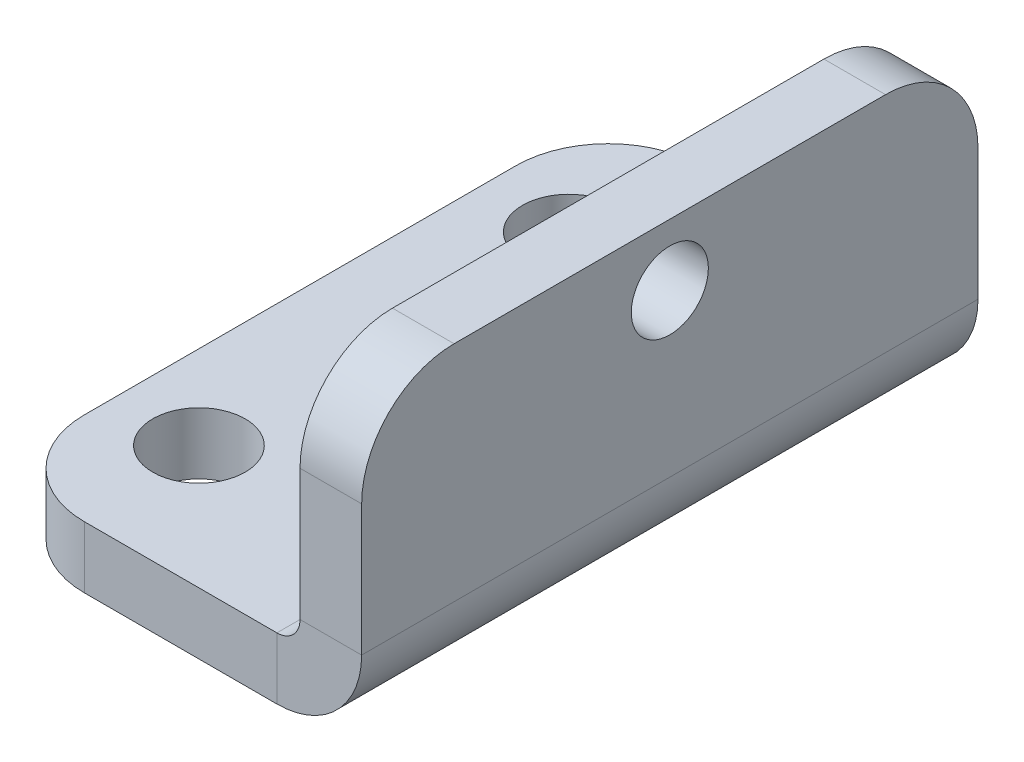
ISO-10303-21;
HEADER;
FILE_DESCRIPTION(('STEP AP214'),'2;1');
FILE_NAME('part.step','',(''),(''),'','','');
FILE_SCHEMA(('AUTOMOTIVE_DESIGN { 1 0 10303 214 1 1 1 1 }'));
ENDSEC;
DATA;
#1=APPLICATION_CONTEXT('core data for automotive mechanical design processes');
#2=APPLICATION_PROTOCOL_DEFINITION('international standard','automotive_design',2000,#1);
#3=PRODUCT_CONTEXT('',#1,'mechanical');
#4=PRODUCT('Part','Part','',(#3));
#5=PRODUCT_RELATED_PRODUCT_CATEGORY('part','',(#4));
#6=PRODUCT_DEFINITION_FORMATION('','',#4);
#7=PRODUCT_DEFINITION_CONTEXT('part definition',#1,'design');
#8=PRODUCT_DEFINITION('design','',#6,#7);
#9=PRODUCT_DEFINITION_SHAPE('','',#8);
#10=(LENGTH_UNIT() NAMED_UNIT(*) SI_UNIT(.MILLI.,.METRE.));
#11=(NAMED_UNIT(*) PLANE_ANGLE_UNIT() SI_UNIT($,.RADIAN.));
#12=(NAMED_UNIT(*) SI_UNIT($,.STERADIAN.) SOLID_ANGLE_UNIT());
#13=UNCERTAINTY_MEASURE_WITH_UNIT(LENGTH_MEASURE(1.E-05),#10,'distance_accuracy_value','');
#14=(GEOMETRIC_REPRESENTATION_CONTEXT(3) GLOBAL_UNCERTAINTY_ASSIGNED_CONTEXT((#13)) GLOBAL_UNIT_ASSIGNED_CONTEXT((#10,
#11,#12)) REPRESENTATION_CONTEXT('',''));
#15=CARTESIAN_POINT('',(0.,0.,0.));
#16=DIRECTION('',(0.,0.,1.));
#17=DIRECTION('',(1.,0.,0.));
#18=AXIS2_PLACEMENT_3D('',#15,#16,#17);
#19=CARTESIAN_POINT('',(3.,2.,7.));
#20=DIRECTION('',(0.,1.,0.));
#21=DIRECTION('',(0.,0.,1.));
#22=AXIS2_PLACEMENT_3D('',#19,#20,#21);
#23=PLANE('',#22);
#24=CARTESIAN_POINT('',(2.72,2.,-6.));
#25=DIRECTION('',(0.,1.,0.));
#26=DIRECTION('',(0.,0.,1.));
#27=AXIS2_PLACEMENT_3D('',#24,#25,#26);
#28=CIRCLE('',#27,1.5);
#29=CARTESIAN_POINT('',(2.72,2.,-4.5));
#30=VERTEX_POINT('',#29);
#31=EDGE_CURVE('E227',#30,#30,#28,.T.);
#32=ORIENTED_EDGE('',*,*,#31,.F.);
#33=EDGE_LOOP('',(#32));
#34=FACE_BOUND('',#33,.T.);
#35=CARTESIAN_POINT('',(2.72,2.,6.));
#36=DIRECTION('',(0.,1.,0.));
#37=DIRECTION('',(0.,0.,1.));
#38=AXIS2_PLACEMENT_3D('',#35,#36,#37);
#39=CIRCLE('',#38,1.5);
#40=CARTESIAN_POINT('',(2.72,2.,7.5));
#41=VERTEX_POINT('',#40);
#42=EDGE_CURVE('E221',#41,#41,#39,.T.);
#43=ORIENTED_EDGE('',*,*,#42,.F.);
#44=EDGE_LOOP('',(#43));
#45=FACE_BOUND('',#44,.T.);
#46=DIRECTION('',(1.,0.,0.));
#47=VECTOR('',#46,1.);
#48=CARTESIAN_POINT('',(3.,2.,10.));
#49=LINE('',#48,#47);
#50=CARTESIAN_POINT('',(3.,2.,10.));
#51=VERTEX_POINT('',#50);
#52=CARTESIAN_POINT('',(9.25,2.,10.));
#53=VERTEX_POINT('',#52);
#54=EDGE_CURVE('E242',#51,#53,#49,.T.);
#55=ORIENTED_EDGE('',*,*,#54,.T.);
#56=DIRECTION('',(0.,0.,-1.));
#57=VECTOR('',#56,1.);
#58=CARTESIAN_POINT('',(9.25,2.,-10.));
#59=LINE('',#58,#57);
#60=CARTESIAN_POINT('',(9.25,2.,-10.));
#61=VERTEX_POINT('',#60);
#62=EDGE_CURVE('E211',#61,#53,#59,.F.);
#63=ORIENTED_EDGE('',*,*,#62,.F.);
#64=DIRECTION('',(-1.,0.,0.));
#65=VECTOR('',#64,1.);
#66=CARTESIAN_POINT('',(3.,2.,-10.));
#67=LINE('',#66,#65);
#68=CARTESIAN_POINT('',(3.,2.,-10.));
#69=VERTEX_POINT('',#68);
#70=EDGE_CURVE('E233',#61,#69,#67,.T.);
#71=ORIENTED_EDGE('',*,*,#70,.T.);
#72=CARTESIAN_POINT('',(3.,2.,-7.));
#73=DIRECTION('',(0.,1.,0.));
#74=DIRECTION('',(0.,0.,-1.));
#75=AXIS2_PLACEMENT_3D('',#72,#73,#74);
#76=CIRCLE('',#75,3.);
#77=CARTESIAN_POINT('',(0.,2.,-7.));
#78=VERTEX_POINT('',#77);
#79=EDGE_CURVE('E235',#69,#78,#76,.T.);
#80=ORIENTED_EDGE('',*,*,#79,.T.);
#81=DIRECTION('',(0.,0.,1.));
#82=VECTOR('',#81,1.);
#83=CARTESIAN_POINT('',(0.,2.,-7.));
#84=LINE('',#83,#82);
#85=CARTESIAN_POINT('',(0.,2.,7.));
#86=VERTEX_POINT('',#85);
#87=EDGE_CURVE('E238',#78,#86,#84,.T.);
#88=ORIENTED_EDGE('',*,*,#87,.T.);
#89=CARTESIAN_POINT('',(3.,2.,7.));
#90=DIRECTION('',(0.,1.,0.));
#91=DIRECTION('',(0.,0.,1.));
#92=AXIS2_PLACEMENT_3D('',#89,#90,#91);
#93=CIRCLE('',#92,3.);
#94=EDGE_CURVE('E240',#86,#51,#93,.T.);
#95=ORIENTED_EDGE('',*,*,#94,.T.);
#96=EDGE_LOOP('',(#55,#63,#71,#80,#88,#95));
#97=FACE_BOUND('',#96,.T.);
#98=ADVANCED_FACE('F67',(#34,#45,#97),#23,.T.);
#99=CARTESIAN_POINT('',(3.,0.,7.));
#100=DIRECTION('',(0.,1.,0.));
#101=DIRECTION('',(0.,0.,1.));
#102=AXIS2_PLACEMENT_3D('',#99,#100,#101);
#103=PLANE('',#102);
#104=CARTESIAN_POINT('',(2.72,0.,6.));
#105=DIRECTION('',(0.,1.,0.));
#106=DIRECTION('',(0.,0.,1.));
#107=AXIS2_PLACEMENT_3D('',#104,#105,#106);
#108=CIRCLE('',#107,1.5);
#109=CARTESIAN_POINT('',(2.72,0.,7.5));
#110=VERTEX_POINT('',#109);
#111=EDGE_CURVE('E218',#110,#110,#108,.T.);
#112=ORIENTED_EDGE('',*,*,#111,.T.);
#113=EDGE_LOOP('',(#112));
#114=FACE_BOUND('',#113,.T.);
#115=CARTESIAN_POINT('',(2.72,0.,-6.));
#116=DIRECTION('',(0.,1.,0.));
#117=DIRECTION('',(0.,0.,1.));
#118=AXIS2_PLACEMENT_3D('',#115,#116,#117);
#119=CIRCLE('',#118,1.5);
#120=CARTESIAN_POINT('',(2.72,0.,-4.5));
#121=VERTEX_POINT('',#120);
#122=EDGE_CURVE('E224',#121,#121,#119,.T.);
#123=ORIENTED_EDGE('',*,*,#122,.T.);
#124=EDGE_LOOP('',(#123));
#125=FACE_BOUND('',#124,.T.);
#126=DIRECTION('',(0.,0.,-1.));
#127=VECTOR('',#126,1.);
#128=CARTESIAN_POINT('',(9.25,0.,-10.));
#129=LINE('',#128,#127);
#130=CARTESIAN_POINT('',(9.25,0.,-10.));
#131=VERTEX_POINT('',#130);
#132=CARTESIAN_POINT('',(9.25,0.,10.));
#133=VERTEX_POINT('',#132);
#134=EDGE_CURVE('E167',#131,#133,#129,.F.);
#135=ORIENTED_EDGE('',*,*,#134,.T.);
#136=DIRECTION('',(1.,0.,0.));
#137=VECTOR('',#136,1.);
#138=CARTESIAN_POINT('',(3.,0.,10.));
#139=LINE('',#138,#137);
#140=CARTESIAN_POINT('',(3.,0.,10.));
#141=VERTEX_POINT('',#140);
#142=EDGE_CURVE('E236',#141,#133,#139,.T.);
#143=ORIENTED_EDGE('',*,*,#142,.F.);
#144=CARTESIAN_POINT('',(3.,0.,7.));
#145=DIRECTION('',(0.,1.,0.));
#146=DIRECTION('',(0.,0.,1.));
#147=AXIS2_PLACEMENT_3D('',#144,#145,#146);
#148=CIRCLE('',#147,3.);
#149=CARTESIAN_POINT('',(0.,0.,7.));
#150=VERTEX_POINT('',#149);
#151=EDGE_CURVE('E251',#150,#141,#148,.T.);
#152=ORIENTED_EDGE('',*,*,#151,.F.);
#153=DIRECTION('',(0.,0.,1.));
#154=VECTOR('',#153,1.);
#155=CARTESIAN_POINT('',(0.,0.,-7.));
#156=LINE('',#155,#154);
#157=CARTESIAN_POINT('',(0.,0.,-7.));
#158=VERTEX_POINT('',#157);
#159=EDGE_CURVE('E249',#158,#150,#156,.T.);
#160=ORIENTED_EDGE('',*,*,#159,.F.);
#161=CARTESIAN_POINT('',(3.,0.,-7.));
#162=DIRECTION('',(0.,1.,0.));
#163=DIRECTION('',(0.,0.,-1.));
#164=AXIS2_PLACEMENT_3D('',#161,#162,#163);
#165=CIRCLE('',#164,3.);
#166=CARTESIAN_POINT('',(3.,0.,-10.));
#167=VERTEX_POINT('',#166);
#168=EDGE_CURVE('E247',#167,#158,#165,.T.);
#169=ORIENTED_EDGE('',*,*,#168,.F.);
#170=DIRECTION('',(-1.,0.,0.));
#171=VECTOR('',#170,1.);
#172=CARTESIAN_POINT('',(3.,0.,-10.));
#173=LINE('',#172,#171);
#174=EDGE_CURVE('E230',#131,#167,#173,.T.);
#175=ORIENTED_EDGE('',*,*,#174,.F.);
#176=EDGE_LOOP('',(#135,#143,#152,#160,#169,#175));
#177=FACE_BOUND('',#176,.T.);
#178=ADVANCED_FACE('F311',(#114,#125,#177),#103,.F.);
#179=CARTESIAN_POINT('',(3.,2.,-10.));
#180=DIRECTION('',(0.,0.,1.));
#181=DIRECTION('',(1.,0.,0.));
#182=AXIS2_PLACEMENT_3D('',#179,#180,#181);
#183=PLANE('',#182);
#184=DIRECTION('',(0.,-1.,0.));
#185=VECTOR('',#184,1.);
#186=CARTESIAN_POINT('',(9.25,2.,-10.));
#187=LINE('',#186,#185);
#188=EDGE_CURVE('E207',#61,#131,#187,.T.);
#189=ORIENTED_EDGE('',*,*,#188,.T.);
#190=ORIENTED_EDGE('',*,*,#174,.T.);
#191=DIRECTION('',(0.,-1.,0.));
#192=VECTOR('',#191,1.);
#193=CARTESIAN_POINT('',(3.,2.,-10.));
#194=LINE('',#193,#192);
#195=EDGE_CURVE('E262',#69,#167,#194,.T.);
#196=ORIENTED_EDGE('',*,*,#195,.F.);
#197=ORIENTED_EDGE('',*,*,#70,.F.);
#198=EDGE_LOOP('',(#189,#190,#196,#197));
#199=FACE_BOUND('',#198,.T.);
#200=ADVANCED_FACE('F316',(#199),#183,.F.);
#201=CARTESIAN_POINT('',(3.,2.,10.));
#202=DIRECTION('',(0.,0.,-1.));
#203=DIRECTION('',(-1.,0.,0.));
#204=AXIS2_PLACEMENT_3D('',#201,#202,#203);
#205=PLANE('',#204);
#206=DIRECTION('',(0.,-1.,0.));
#207=VECTOR('',#206,1.);
#208=CARTESIAN_POINT('',(9.25,2.,10.));
#209=LINE('',#208,#207);
#210=EDGE_CURVE('E215',#53,#133,#209,.T.);
#211=ORIENTED_EDGE('',*,*,#210,.F.);
#212=ORIENTED_EDGE('',*,*,#54,.F.);
#213=DIRECTION('',(0.,-1.,0.));
#214=VECTOR('',#213,1.);
#215=CARTESIAN_POINT('',(3.,2.,10.));
#216=LINE('',#215,#214);
#217=EDGE_CURVE('E245',#51,#141,#216,.T.);
#218=ORIENTED_EDGE('',*,*,#217,.T.);
#219=ORIENTED_EDGE('',*,*,#142,.T.);
#220=EDGE_LOOP('',(#211,#212,#218,#219));
#221=FACE_BOUND('',#220,.T.);
#222=ADVANCED_FACE('F299',(#221),#205,.F.);
#223=CARTESIAN_POINT('',(3.,2.,-7.));
#224=DIRECTION('',(0.,-1.,0.));
#225=DIRECTION('',(0.,0.,-1.));
#226=AXIS2_PLACEMENT_3D('',#223,#224,#225);
#227=CYLINDRICAL_SURFACE('',#226,3.);
#228=ORIENTED_EDGE('',*,*,#168,.T.);
#229=DIRECTION('',(0.,-1.,0.));
#230=VECTOR('',#229,1.);
#231=CARTESIAN_POINT('',(0.,2.,-7.));
#232=LINE('',#231,#230);
#233=EDGE_CURVE('E259',#78,#158,#232,.T.);
#234=ORIENTED_EDGE('',*,*,#233,.F.);
#235=ORIENTED_EDGE('',*,*,#79,.F.);
#236=ORIENTED_EDGE('',*,*,#195,.T.);
#237=EDGE_LOOP('',(#228,#234,#235,#236));
#238=FACE_BOUND('',#237,.T.);
#239=ADVANCED_FACE('F320',(#238),#227,.T.);
#240=CARTESIAN_POINT('',(0.,2.,-7.));
#241=DIRECTION('',(1.,0.,0.));
#242=DIRECTION('',(0.,0.,-1.));
#243=AXIS2_PLACEMENT_3D('',#240,#241,#242);
#244=PLANE('',#243);
#245=ORIENTED_EDGE('',*,*,#159,.T.);
#246=DIRECTION('',(0.,-1.,0.));
#247=VECTOR('',#246,1.);
#248=CARTESIAN_POINT('',(0.,2.,7.));
#249=LINE('',#248,#247);
#250=EDGE_CURVE('E256',#86,#150,#249,.T.);
#251=ORIENTED_EDGE('',*,*,#250,.F.);
#252=ORIENTED_EDGE('',*,*,#87,.F.);
#253=ORIENTED_EDGE('',*,*,#233,.T.);
#254=EDGE_LOOP('',(#245,#251,#252,#253));
#255=FACE_BOUND('',#254,.T.);
#256=ADVANCED_FACE('F322',(#255),#244,.F.);
#257=CARTESIAN_POINT('',(3.,2.,7.));
#258=DIRECTION('',(0.,-1.,0.));
#259=DIRECTION('',(0.,0.,-1.));
#260=AXIS2_PLACEMENT_3D('',#257,#258,#259);
#261=CYLINDRICAL_SURFACE('',#260,3.);
#262=ORIENTED_EDGE('',*,*,#151,.T.);
#263=ORIENTED_EDGE('',*,*,#217,.F.);
#264=ORIENTED_EDGE('',*,*,#94,.F.);
#265=ORIENTED_EDGE('',*,*,#250,.T.);
#266=EDGE_LOOP('',(#262,#263,#264,#265));
#267=FACE_BOUND('',#266,.T.);
#268=ADVANCED_FACE('F308',(#267),#261,.T.);
#269=CARTESIAN_POINT('',(2.72,2.,-6.));
#270=DIRECTION('',(0.,-1.,0.));
#271=DIRECTION('',(0.,0.,-1.));
#272=AXIS2_PLACEMENT_3D('',#269,#270,#271);
#273=CYLINDRICAL_SURFACE('',#272,1.5);
#274=ORIENTED_EDGE('',*,*,#31,.T.);
#275=EDGE_LOOP('',(#274));
#276=FACE_BOUND('',#275,.T.);
#277=ORIENTED_EDGE('',*,*,#122,.F.);
#278=EDGE_LOOP('',(#277));
#279=FACE_BOUND('',#278,.T.);
#280=ADVANCED_FACE('F329',(#276,#279),#273,.F.);
#281=CARTESIAN_POINT('',(2.72,2.,6.));
#282=DIRECTION('',(0.,-1.,0.));
#283=DIRECTION('',(0.,0.,-1.));
#284=AXIS2_PLACEMENT_3D('',#281,#282,#283);
#285=CYLINDRICAL_SURFACE('',#284,1.5);
#286=ORIENTED_EDGE('',*,*,#42,.T.);
#287=EDGE_LOOP('',(#286));
#288=FACE_BOUND('',#287,.T.);
#289=ORIENTED_EDGE('',*,*,#111,.F.);
#290=EDGE_LOOP('',(#289));
#291=FACE_BOUND('',#290,.T.);
#292=ADVANCED_FACE('F384',(#288,#291),#285,.F.);
#293=CARTESIAN_POINT('',(9.25,2.75,10.));
#294=DIRECTION('',(0.,0.,1.));
#295=DIRECTION('',(1.,0.,0.));
#296=AXIS2_PLACEMENT_3D('',#293,#294,#295);
#297=PLANE('',#296);
#298=DIRECTION('',(-1.,0.,0.));
#299=VECTOR('',#298,1.);
#300=CARTESIAN_POINT('',(12.,2.74999999999999,10.));
#301=LINE('',#300,#299);
#302=CARTESIAN_POINT('',(10.,2.75,10.));
#303=VERTEX_POINT('',#302);
#304=CARTESIAN_POINT('',(12.,2.74999999999999,10.));
#305=VERTEX_POINT('',#304);
#306=EDGE_CURVE('E201',#303,#305,#301,.F.);
#307=ORIENTED_EDGE('',*,*,#306,.F.);
#308=CARTESIAN_POINT('',(9.25,2.75,10.));
#309=DIRECTION('',(0.,0.,-1.));
#310=DIRECTION('',(-1.,0.,0.));
#311=AXIS2_PLACEMENT_3D('',#308,#309,#310);
#312=CIRCLE('',#311,0.750000000000002);
#313=EDGE_CURVE('E170',#53,#303,#312,.F.);
#314=ORIENTED_EDGE('',*,*,#313,.F.);
#315=ORIENTED_EDGE('',*,*,#210,.T.);
#316=CARTESIAN_POINT('',(9.25,2.75,10.));
#317=DIRECTION('',(0.,0.,-1.));
#318=DIRECTION('',(-1.,0.,0.));
#319=AXIS2_PLACEMENT_3D('',#316,#317,#318);
#320=CIRCLE('',#319,2.75);
#321=EDGE_CURVE('E206',#133,#305,#320,.F.);
#322=ORIENTED_EDGE('',*,*,#321,.T.);
#323=EDGE_LOOP('',(#307,#314,#315,#322));
#324=FACE_BOUND('',#323,.T.);
#325=ADVANCED_FACE('F296',(#324),#297,.T.);
#326=CARTESIAN_POINT('',(9.25,2.75,-10.));
#327=DIRECTION('',(0.,0.,1.));
#328=DIRECTION('',(1.,0.,0.));
#329=AXIS2_PLACEMENT_3D('',#326,#327,#328);
#330=PLANE('',#329);
#331=CARTESIAN_POINT('',(9.25,2.75,-10.));
#332=DIRECTION('',(0.,0.,-1.));
#333=DIRECTION('',(-1.,0.,0.));
#334=AXIS2_PLACEMENT_3D('',#331,#332,#333);
#335=CIRCLE('',#334,0.750000000000002);
#336=CARTESIAN_POINT('',(10.,2.75,-10.));
#337=VERTEX_POINT('',#336);
#338=EDGE_CURVE('E177',#337,#61,#335,.T.);
#339=ORIENTED_EDGE('',*,*,#338,.F.);
#340=DIRECTION('',(-1.,0.,0.));
#341=VECTOR('',#340,1.);
#342=CARTESIAN_POINT('',(10.,2.75,-10.));
#343=LINE('',#342,#341);
#344=CARTESIAN_POINT('',(12.,2.74999999999999,-10.));
#345=VERTEX_POINT('',#344);
#346=EDGE_CURVE('E174',#337,#345,#343,.F.);
#347=ORIENTED_EDGE('',*,*,#346,.T.);
#348=CARTESIAN_POINT('',(9.25,2.75,-10.));
#349=DIRECTION('',(0.,0.,-1.));
#350=DIRECTION('',(-1.,0.,0.));
#351=AXIS2_PLACEMENT_3D('',#348,#349,#350);
#352=CIRCLE('',#351,2.75);
#353=EDGE_CURVE('E159',#345,#131,#352,.T.);
#354=ORIENTED_EDGE('',*,*,#353,.T.);
#355=ORIENTED_EDGE('',*,*,#188,.F.);
#356=EDGE_LOOP('',(#339,#347,#354,#355));
#357=FACE_BOUND('',#356,.T.);
#358=ADVANCED_FACE('F175',(#357),#330,.F.);
#359=CARTESIAN_POINT('',(9.25,2.75,-10.));
#360=DIRECTION('',(0.,0.,-1.));
#361=DIRECTION('',(1.,0.,0.));
#362=AXIS2_PLACEMENT_3D('',#359,#360,#361);
#363=CYLINDRICAL_SURFACE('',#362,2.75);
#364=ORIENTED_EDGE('',*,*,#134,.F.);
#365=ORIENTED_EDGE('',*,*,#353,.F.);
#366=DIRECTION('',(0.,0.,-1.));
#367=VECTOR('',#366,1.);
#368=CARTESIAN_POINT('',(12.,2.74999999999999,10.));
#369=LINE('',#368,#367);
#370=EDGE_CURVE('E164',#345,#305,#369,.F.);
#371=ORIENTED_EDGE('',*,*,#370,.T.);
#372=ORIENTED_EDGE('',*,*,#321,.F.);
#373=EDGE_LOOP('',(#364,#365,#371,#372));
#374=FACE_BOUND('',#373,.T.);
#375=ADVANCED_FACE('F161',(#374),#363,.T.);
#376=CARTESIAN_POINT('',(9.25,2.75,-10.));
#377=DIRECTION('',(0.,0.,-1.));
#378=DIRECTION('',(1.,0.,0.));
#379=AXIS2_PLACEMENT_3D('',#376,#377,#378);
#380=CYLINDRICAL_SURFACE('',#379,0.750000000000002);
#381=ORIENTED_EDGE('',*,*,#62,.T.);
#382=ORIENTED_EDGE('',*,*,#313,.T.);
#383=DIRECTION('',(0.,0.,-1.));
#384=VECTOR('',#383,1.);
#385=CARTESIAN_POINT('',(10.,2.75,10.));
#386=LINE('',#385,#384);
#387=EDGE_CURVE('E179',#303,#337,#386,.T.);
#388=ORIENTED_EDGE('',*,*,#387,.T.);
#389=ORIENTED_EDGE('',*,*,#338,.T.);
#390=EDGE_LOOP('',(#381,#382,#388,#389));
#391=FACE_BOUND('',#390,.T.);
#392=ADVANCED_FACE('F293',(#391),#380,.F.);
#393=CARTESIAN_POINT('',(12.,9.99999999999999,-10.));
#394=DIRECTION('',(0.,0.,1.));
#395=DIRECTION('',(0.,-1.,0.));
#396=AXIS2_PLACEMENT_3D('',#393,#394,#395);
#397=PLANE('',#396);
#398=DIRECTION('',(0.,-1.,0.));
#399=VECTOR('',#398,1.);
#400=CARTESIAN_POINT('',(10.,10.,-10.));
#401=LINE('',#400,#399);
#402=CARTESIAN_POINT('',(10.,7.,-10.));
#403=VERTEX_POINT('',#402);
#404=EDGE_CURVE('E187',#337,#403,#401,.F.);
#405=ORIENTED_EDGE('',*,*,#404,.T.);
#406=DIRECTION('',(-1.,0.,0.));
#407=VECTOR('',#406,1.);
#408=CARTESIAN_POINT('',(12.,6.99999999999999,-10.));
#409=LINE('',#408,#407);
#410=CARTESIAN_POINT('',(12.,6.99999999999999,-10.));
#411=VERTEX_POINT('',#410);
#412=EDGE_CURVE('E13',#403,#411,#409,.F.);
#413=ORIENTED_EDGE('',*,*,#412,.T.);
#414=DIRECTION('',(0.,1.,0.));
#415=VECTOR('',#414,1.);
#416=CARTESIAN_POINT('',(12.,0.,-10.));
#417=LINE('',#416,#415);
#418=EDGE_CURVE('E183',#345,#411,#417,.T.);
#419=ORIENTED_EDGE('',*,*,#418,.F.);
#420=ORIENTED_EDGE('',*,*,#346,.F.);
#421=EDGE_LOOP('',(#405,#413,#419,#420));
#422=FACE_BOUND('',#421,.T.);
#423=ADVANCED_FACE('F189',(#422),#397,.F.);
#424=CARTESIAN_POINT('',(12.,1.99999999999999,10.));
#425=DIRECTION('',(0.,0.,-1.));
#426=DIRECTION('',(-1.,0.,0.));
#427=AXIS2_PLACEMENT_3D('',#424,#425,#426);
#428=PLANE('',#427);
#429=DIRECTION('',(0.,-1.,0.));
#430=VECTOR('',#429,1.);
#431=CARTESIAN_POINT('',(12.,0.,10.));
#432=LINE('',#431,#430);
#433=CARTESIAN_POINT('',(12.,6.99999999999999,10.));
#434=VERTEX_POINT('',#433);
#435=EDGE_CURVE('E186',#434,#305,#432,.T.);
#436=ORIENTED_EDGE('',*,*,#435,.F.);
#437=DIRECTION('',(-1.,0.,0.));
#438=VECTOR('',#437,1.);
#439=CARTESIAN_POINT('',(12.,6.99999999999999,10.));
#440=LINE('',#439,#438);
#441=CARTESIAN_POINT('',(10.,7.,10.));
#442=VERTEX_POINT('',#441);
#443=EDGE_CURVE('E265',#434,#442,#440,.T.);
#444=ORIENTED_EDGE('',*,*,#443,.T.);
#445=DIRECTION('',(0.,1.,0.));
#446=VECTOR('',#445,1.);
#447=CARTESIAN_POINT('',(10.,2.,10.));
#448=LINE('',#447,#446);
#449=EDGE_CURVE('E191',#442,#303,#448,.F.);
#450=ORIENTED_EDGE('',*,*,#449,.T.);
#451=ORIENTED_EDGE('',*,*,#306,.T.);
#452=EDGE_LOOP('',(#436,#444,#450,#451));
#453=FACE_BOUND('',#452,.T.);
#454=ADVANCED_FACE('F281',(#453),#428,.F.);
#455=CARTESIAN_POINT('',(12.,0.,0.));
#456=DIRECTION('',(-1.,0.,0.));
#457=DIRECTION('',(0.,-1.,0.));
#458=AXIS2_PLACEMENT_3D('',#455,#456,#457);
#459=PLANE('',#458);
#460=CARTESIAN_POINT('',(12.,7.99999999999999,0.));
#461=DIRECTION('',(-1.,0.,0.));
#462=DIRECTION('',(0.,-1.,0.));
#463=AXIS2_PLACEMENT_3D('',#460,#461,#462);
#464=CIRCLE('',#463,1.25);
#465=CARTESIAN_POINT('',(12.,6.74999999999999,0.));
#466=VERTEX_POINT('',#465);
#467=EDGE_CURVE('E204',#466,#466,#464,.T.);
#468=ORIENTED_EDGE('',*,*,#467,.T.);
#469=EDGE_LOOP('',(#468));
#470=FACE_BOUND('',#469,.T.);
#471=DIRECTION('',(0.,0.,1.));
#472=VECTOR('',#471,1.);
#473=CARTESIAN_POINT('',(12.,9.99999999999999,0.));
#474=LINE('',#473,#472);
#475=CARTESIAN_POINT('',(12.,9.99999999999999,-7.));
#476=VERTEX_POINT('',#475);
#477=CARTESIAN_POINT('',(12.,9.99999999999999,7.));
#478=VERTEX_POINT('',#477);
#479=EDGE_CURVE('E190',#476,#478,#474,.T.);
#480=ORIENTED_EDGE('',*,*,#479,.T.);
#481=CARTESIAN_POINT('',(12.,6.99999999999999,7.));
#482=DIRECTION('',(-1.,0.,0.));
#483=DIRECTION('',(0.,-1.,0.));
#484=AXIS2_PLACEMENT_3D('',#481,#482,#483);
#485=CIRCLE('',#484,3.);
#486=EDGE_CURVE('E75',#478,#434,#485,.F.);
#487=ORIENTED_EDGE('',*,*,#486,.T.);
#488=ORIENTED_EDGE('',*,*,#435,.T.);
#489=ORIENTED_EDGE('',*,*,#370,.F.);
#490=ORIENTED_EDGE('',*,*,#418,.T.);
#491=CARTESIAN_POINT('',(12.,6.99999999999999,-7.));
#492=DIRECTION('',(-1.,0.,0.));
#493=DIRECTION('',(0.,-1.,0.));
#494=AXIS2_PLACEMENT_3D('',#491,#492,#493);
#495=CIRCLE('',#494,3.);
#496=EDGE_CURVE('E276',#411,#476,#495,.F.);
#497=ORIENTED_EDGE('',*,*,#496,.T.);
#498=EDGE_LOOP('',(#480,#487,#488,#489,#490,#497));
#499=FACE_BOUND('',#498,.T.);
#500=ADVANCED_FACE('F182',(#470,#499),#459,.F.);
#501=CARTESIAN_POINT('',(9.99999999999999,0.,0.));
#502=DIRECTION('',(-1.,0.,0.));
#503=DIRECTION('',(0.,-1.,0.));
#504=AXIS2_PLACEMENT_3D('',#501,#502,#503);
#505=PLANE('',#504);
#506=CARTESIAN_POINT('',(10.,8.,0.));
#507=DIRECTION('',(-1.,0.,0.));
#508=DIRECTION('',(0.,-1.,0.));
#509=AXIS2_PLACEMENT_3D('',#506,#507,#508);
#510=CIRCLE('',#509,1.25);
#511=CARTESIAN_POINT('',(10.,6.75,0.));
#512=VERTEX_POINT('',#511);
#513=EDGE_CURVE('E530',#512,#512,#510,.T.);
#514=ORIENTED_EDGE('',*,*,#513,.F.);
#515=EDGE_LOOP('',(#514));
#516=FACE_BOUND('',#515,.T.);
#517=ORIENTED_EDGE('',*,*,#449,.F.);
#518=CARTESIAN_POINT('',(10.,7.,7.));
#519=DIRECTION('',(-1.,0.,0.));
#520=DIRECTION('',(0.,-1.,0.));
#521=AXIS2_PLACEMENT_3D('',#518,#519,#520);
#522=CIRCLE('',#521,3.);
#523=CARTESIAN_POINT('',(10.,10.,7.));
#524=VERTEX_POINT('',#523);
#525=EDGE_CURVE('E270',#442,#524,#522,.T.);
#526=ORIENTED_EDGE('',*,*,#525,.T.);
#527=DIRECTION('',(0.,0.,-1.));
#528=VECTOR('',#527,1.);
#529=CARTESIAN_POINT('',(10.,10.,10.));
#530=LINE('',#529,#528);
#531=CARTESIAN_POINT('',(10.,10.,-7.));
#532=VERTEX_POINT('',#531);
#533=EDGE_CURVE('E194',#532,#524,#530,.F.);
#534=ORIENTED_EDGE('',*,*,#533,.F.);
#535=CARTESIAN_POINT('',(10.,7.,-7.));
#536=DIRECTION('',(-1.,0.,0.));
#537=DIRECTION('',(0.,-1.,0.));
#538=AXIS2_PLACEMENT_3D('',#535,#536,#537);
#539=CIRCLE('',#538,3.);
#540=EDGE_CURVE('E268',#532,#403,#539,.T.);
#541=ORIENTED_EDGE('',*,*,#540,.T.);
#542=ORIENTED_EDGE('',*,*,#404,.F.);
#543=ORIENTED_EDGE('',*,*,#387,.F.);
#544=EDGE_LOOP('',(#517,#526,#534,#541,#542,#543));
#545=FACE_BOUND('',#544,.T.);
#546=ADVANCED_FACE('F287',(#516,#545),#505,.T.);
#547=CARTESIAN_POINT('',(12.,9.99999999999999,10.));
#548=DIRECTION('',(0.,-1.,0.));
#549=DIRECTION('',(1.,0.,0.));
#550=AXIS2_PLACEMENT_3D('',#547,#548,#549);
#551=PLANE('',#550);
#552=ORIENTED_EDGE('',*,*,#533,.T.);
#553=DIRECTION('',(-1.,0.,0.));
#554=VECTOR('',#553,1.);
#555=CARTESIAN_POINT('',(12.,9.99999999999999,7.));
#556=LINE('',#555,#554);
#557=EDGE_CURVE('E88',#524,#478,#556,.F.);
#558=ORIENTED_EDGE('',*,*,#557,.T.);
#559=ORIENTED_EDGE('',*,*,#479,.F.);
#560=DIRECTION('',(-1.,0.,0.));
#561=VECTOR('',#560,1.);
#562=CARTESIAN_POINT('',(12.,9.99999999999999,-7.));
#563=LINE('',#562,#561);
#564=EDGE_CURVE('E272',#476,#532,#563,.T.);
#565=ORIENTED_EDGE('',*,*,#564,.T.);
#566=EDGE_LOOP('',(#552,#558,#559,#565));
#567=FACE_BOUND('',#566,.T.);
#568=ADVANCED_FACE('F289',(#567),#551,.F.);
#569=CARTESIAN_POINT('',(20.,7.99999999999997,0.));
#570=DIRECTION('',(-1.,0.,0.));
#571=DIRECTION('',(0.,-1.,0.));
#572=AXIS2_PLACEMENT_3D('',#569,#570,#571);
#573=CYLINDRICAL_SURFACE('',#572,1.25);
#574=ORIENTED_EDGE('',*,*,#513,.T.);
#575=EDGE_LOOP('',(#574));
#576=FACE_BOUND('',#575,.T.);
#577=ORIENTED_EDGE('',*,*,#467,.F.);
#578=EDGE_LOOP('',(#577));
#579=FACE_BOUND('',#578,.T.);
#580=ADVANCED_FACE('F355',(#576,#579),#573,.F.);
#581=CARTESIAN_POINT('',(12.,6.99999999999999,7.));
#582=DIRECTION('',(-1.,0.,0.));
#583=DIRECTION('',(0.,-1.,0.));
#584=AXIS2_PLACEMENT_3D('',#581,#582,#583);
#585=CYLINDRICAL_SURFACE('',#584,3.);
#586=ORIENTED_EDGE('',*,*,#486,.F.);
#587=ORIENTED_EDGE('',*,*,#557,.F.);
#588=ORIENTED_EDGE('',*,*,#525,.F.);
#589=ORIENTED_EDGE('',*,*,#443,.F.);
#590=EDGE_LOOP('',(#586,#587,#588,#589));
#591=FACE_BOUND('',#590,.T.);
#592=ADVANCED_FACE('F284',(#591),#585,.T.);
#593=CARTESIAN_POINT('',(12.,6.99999999999999,-7.));
#594=DIRECTION('',(-1.,0.,0.));
#595=DIRECTION('',(0.,-1.,0.));
#596=AXIS2_PLACEMENT_3D('',#593,#594,#595);
#597=CYLINDRICAL_SURFACE('',#596,3.);
#598=ORIENTED_EDGE('',*,*,#496,.F.);
#599=ORIENTED_EDGE('',*,*,#412,.F.);
#600=ORIENTED_EDGE('',*,*,#540,.F.);
#601=ORIENTED_EDGE('',*,*,#564,.F.);
#602=EDGE_LOOP('',(#598,#599,#600,#601));
#603=FACE_BOUND('',#602,.T.);
#604=ADVANCED_FACE('F69',(#603),#597,.T.);
#605=CLOSED_SHELL('',(#98,#178,#200,#222,#239,#256,#268,#280,#292,#325,#358,#375,#392,#423,#454,
#500,#546,#568,#580,#592,#604));
#606=MANIFOLD_SOLID_BREP('B2',#605);
#607=ADVANCED_BREP_SHAPE_REPRESENTATION('',(#18,#606),#14);
#608=SHAPE_DEFINITION_REPRESENTATION(#9,#607);
ENDSEC;
END-ISO-10303-21;
